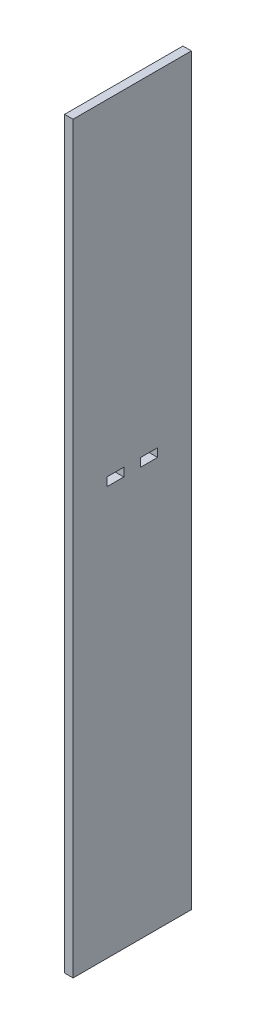
ISO-10303-21;
HEADER;
FILE_DESCRIPTION(('STEP AP214'),'2;1');
FILE_NAME('part.step','',(''),(''),'','','');
FILE_SCHEMA(('AUTOMOTIVE_DESIGN { 1 0 10303 214 1 1 1 1 }'));
ENDSEC;
DATA;
#1=APPLICATION_CONTEXT('core data for automotive mechanical design processes');
#2=APPLICATION_PROTOCOL_DEFINITION('international standard','automotive_design',2000,#1);
#3=PRODUCT_CONTEXT('',#1,'mechanical');
#4=PRODUCT('Part','Part','',(#3));
#5=PRODUCT_RELATED_PRODUCT_CATEGORY('part','',(#4));
#6=PRODUCT_DEFINITION_FORMATION('','',#4);
#7=PRODUCT_DEFINITION_CONTEXT('part definition',#1,'design');
#8=PRODUCT_DEFINITION('design','',#6,#7);
#9=PRODUCT_DEFINITION_SHAPE('','',#8);
#10=(LENGTH_UNIT() NAMED_UNIT(*) SI_UNIT(.MILLI.,.METRE.));
#11=(NAMED_UNIT(*) PLANE_ANGLE_UNIT() SI_UNIT($,.RADIAN.));
#12=(NAMED_UNIT(*) SI_UNIT($,.STERADIAN.) SOLID_ANGLE_UNIT());
#13=UNCERTAINTY_MEASURE_WITH_UNIT(LENGTH_MEASURE(1.E-05),#10,'distance_accuracy_value','');
#14=(GEOMETRIC_REPRESENTATION_CONTEXT(3) GLOBAL_UNCERTAINTY_ASSIGNED_CONTEXT((#13)) GLOBAL_UNIT_ASSIGNED_CONTEXT((#10,
#11,#12)) REPRESENTATION_CONTEXT('',''));
#15=CARTESIAN_POINT('',(0.,0.,0.));
#16=DIRECTION('',(0.,0.,1.));
#17=DIRECTION('',(1.,0.,0.));
#18=AXIS2_PLACEMENT_3D('',#15,#16,#17);
#19=CARTESIAN_POINT('',(-38.1,558.8,44.45));
#20=DIRECTION('',(-1.,0.,0.));
#21=DIRECTION('',(0.,0.,1.));
#22=AXIS2_PLACEMENT_3D('',#19,#20,#21);
#23=PLANE('',#22);
#24=DIRECTION('',(0.,0.,-1.));
#25=VECTOR('',#24,1.);
#26=CARTESIAN_POINT('',(-38.1,313.305,6.34999999999996));
#27=LINE('',#26,#25);
#28=CARTESIAN_POINT('',(-38.1,313.305,19.05));
#29=VERTEX_POINT('',#28);
#30=CARTESIAN_POINT('',(-38.1,313.305,6.34999999999996));
#31=VERTEX_POINT('',#30);
#32=EDGE_CURVE('E128',#29,#31,#27,.T.);
#33=ORIENTED_EDGE('',*,*,#32,.T.);
#34=DIRECTION('',(0.,-1.,0.));
#35=VECTOR('',#34,1.);
#36=CARTESIAN_POINT('',(-38.1,313.305,6.34999999999996));
#37=LINE('',#36,#35);
#38=CARTESIAN_POINT('',(-38.1,306.955,6.34999999999996));
#39=VERTEX_POINT('',#38);
#40=EDGE_CURVE('E122',#31,#39,#37,.T.);
#41=ORIENTED_EDGE('',*,*,#40,.T.);
#42=DIRECTION('',(0.,0.,1.));
#43=VECTOR('',#42,1.);
#44=CARTESIAN_POINT('',(-38.1,306.955,6.34999999999996));
#45=LINE('',#44,#43);
#46=CARTESIAN_POINT('',(-38.1,306.955,19.05));
#47=VERTEX_POINT('',#46);
#48=EDGE_CURVE('E131',#39,#47,#45,.T.);
#49=ORIENTED_EDGE('',*,*,#48,.T.);
#50=DIRECTION('',(0.,1.,0.));
#51=VECTOR('',#50,1.);
#52=CARTESIAN_POINT('',(-38.1,313.305,19.05));
#53=LINE('',#52,#51);
#54=EDGE_CURVE('E46',#47,#29,#53,.T.);
#55=ORIENTED_EDGE('',*,*,#54,.T.);
#56=EDGE_LOOP('',(#33,#41,#49,#55));
#57=FACE_BOUND('',#56,.T.);
#58=DIRECTION('',(0.,0.,-1.));
#59=VECTOR('',#58,1.);
#60=CARTESIAN_POINT('',(-38.1,313.305,-19.05));
#61=LINE('',#60,#59);
#62=CARTESIAN_POINT('',(-38.1,313.305,-6.35000000000004));
#63=VERTEX_POINT('',#62);
#64=CARTESIAN_POINT('',(-38.1,313.305,-19.05));
#65=VERTEX_POINT('',#64);
#66=EDGE_CURVE('E166',#63,#65,#61,.T.);
#67=ORIENTED_EDGE('',*,*,#66,.T.);
#68=DIRECTION('',(0.,-1.,0.));
#69=VECTOR('',#68,1.);
#70=CARTESIAN_POINT('',(-38.1,313.305,-19.05));
#71=LINE('',#70,#69);
#72=CARTESIAN_POINT('',(-38.1,306.955,-19.05));
#73=VERTEX_POINT('',#72);
#74=EDGE_CURVE('E156',#65,#73,#71,.T.);
#75=ORIENTED_EDGE('',*,*,#74,.T.);
#76=DIRECTION('',(0.,0.,1.));
#77=VECTOR('',#76,1.);
#78=CARTESIAN_POINT('',(-38.1,306.955,-19.05));
#79=LINE('',#78,#77);
#80=CARTESIAN_POINT('',(-38.1,306.955,-6.35000000000004));
#81=VERTEX_POINT('',#80);
#82=EDGE_CURVE('E159',#73,#81,#79,.T.);
#83=ORIENTED_EDGE('',*,*,#82,.T.);
#84=DIRECTION('',(0.,1.,0.));
#85=VECTOR('',#84,1.);
#86=CARTESIAN_POINT('',(-38.1,313.305,-6.35000000000004));
#87=LINE('',#86,#85);
#88=EDGE_CURVE('E163',#81,#63,#87,.T.);
#89=ORIENTED_EDGE('',*,*,#88,.T.);
#90=EDGE_LOOP('',(#67,#75,#83,#89));
#91=FACE_BOUND('',#90,.T.);
#92=DIRECTION('',(0.,0.,-1.));
#93=VECTOR('',#92,1.);
#94=CARTESIAN_POINT('',(-38.1,0.,44.45));
#95=LINE('',#94,#93);
#96=CARTESIAN_POINT('',(-38.1,0.,44.45));
#97=VERTEX_POINT('',#96);
#98=CARTESIAN_POINT('',(-38.1,0.,-44.45));
#99=VERTEX_POINT('',#98);
#100=EDGE_CURVE('E181',#97,#99,#95,.T.);
#101=ORIENTED_EDGE('',*,*,#100,.T.);
#102=DIRECTION('',(0.,-1.,0.));
#103=VECTOR('',#102,1.);
#104=CARTESIAN_POINT('',(-38.1,558.8,-44.45));
#105=LINE('',#104,#103);
#106=CARTESIAN_POINT('',(-38.1,558.8,-44.45));
#107=VERTEX_POINT('',#106);
#108=EDGE_CURVE('E11',#107,#99,#105,.T.);
#109=ORIENTED_EDGE('',*,*,#108,.F.);
#110=DIRECTION('',(0.,0.,-1.));
#111=VECTOR('',#110,1.);
#112=CARTESIAN_POINT('',(-38.1,558.8,44.45));
#113=LINE('',#112,#111);
#114=CARTESIAN_POINT('',(-38.1,558.8,44.45));
#115=VERTEX_POINT('',#114);
#116=EDGE_CURVE('E188',#115,#107,#113,.T.);
#117=ORIENTED_EDGE('',*,*,#116,.F.);
#118=DIRECTION('',(0.,-1.,0.));
#119=VECTOR('',#118,1.);
#120=CARTESIAN_POINT('',(-38.1,558.8,44.45));
#121=LINE('',#120,#119);
#122=EDGE_CURVE('E198',#115,#97,#121,.T.);
#123=ORIENTED_EDGE('',*,*,#122,.T.);
#124=EDGE_LOOP('',(#101,#109,#117,#123));
#125=FACE_BOUND('',#124,.T.);
#126=ADVANCED_FACE('F32',(#57,#91,#125),#23,.F.);
#127=CARTESIAN_POINT('',(-38.1,558.8,-44.45));
#128=DIRECTION('',(0.,0.,1.));
#129=DIRECTION('',(1.,0.,0.));
#130=AXIS2_PLACEMENT_3D('',#127,#128,#129);
#131=PLANE('',#130);
#132=DIRECTION('',(-1.,0.,0.));
#133=VECTOR('',#132,1.);
#134=CARTESIAN_POINT('',(-38.1,0.,-44.45));
#135=LINE('',#134,#133);
#136=CARTESIAN_POINT('',(-44.45,0.,-44.45));
#137=VERTEX_POINT('',#136);
#138=EDGE_CURVE('E201',#99,#137,#135,.T.);
#139=ORIENTED_EDGE('',*,*,#138,.T.);
#140=DIRECTION('',(0.,-1.,0.));
#141=VECTOR('',#140,1.);
#142=CARTESIAN_POINT('',(-44.45,558.8,-44.45));
#143=LINE('',#142,#141);
#144=CARTESIAN_POINT('',(-44.45,558.8,-44.45));
#145=VERTEX_POINT('',#144);
#146=EDGE_CURVE('E39',#145,#137,#143,.T.);
#147=ORIENTED_EDGE('',*,*,#146,.F.);
#148=DIRECTION('',(-1.,0.,0.));
#149=VECTOR('',#148,1.);
#150=CARTESIAN_POINT('',(-38.1,558.8,-44.45));
#151=LINE('',#150,#149);
#152=EDGE_CURVE('E191',#107,#145,#151,.T.);
#153=ORIENTED_EDGE('',*,*,#152,.F.);
#154=ORIENTED_EDGE('',*,*,#108,.T.);
#155=EDGE_LOOP('',(#139,#147,#153,#154));
#156=FACE_BOUND('',#155,.T.);
#157=ADVANCED_FACE('F231',(#156),#131,.F.);
#158=CARTESIAN_POINT('',(-44.45,558.8,44.45));
#159=DIRECTION('',(1.,0.,0.));
#160=DIRECTION('',(0.,0.,-1.));
#161=AXIS2_PLACEMENT_3D('',#158,#159,#160);
#162=PLANE('',#161);
#163=DIRECTION('',(0.,0.,1.));
#164=VECTOR('',#163,1.);
#165=CARTESIAN_POINT('',(-44.45,306.955,6.34999999999996));
#166=LINE('',#165,#164);
#167=CARTESIAN_POINT('',(-44.45,306.955,6.34999999999997));
#168=VERTEX_POINT('',#167);
#169=CARTESIAN_POINT('',(-44.45,306.955,19.05));
#170=VERTEX_POINT('',#169);
#171=EDGE_CURVE('E146',#168,#170,#166,.T.);
#172=ORIENTED_EDGE('',*,*,#171,.F.);
#173=DIRECTION('',(0.,-1.,0.));
#174=VECTOR('',#173,1.);
#175=CARTESIAN_POINT('',(-44.45,313.305,6.34999999999996));
#176=LINE('',#175,#174);
#177=CARTESIAN_POINT('',(-44.45,313.305,6.34999999999996));
#178=VERTEX_POINT('',#177);
#179=EDGE_CURVE('E54',#178,#168,#176,.T.);
#180=ORIENTED_EDGE('',*,*,#179,.F.);
#181=DIRECTION('',(0.,0.,-1.));
#182=VECTOR('',#181,1.);
#183=CARTESIAN_POINT('',(-44.45,313.305,6.34999999999996));
#184=LINE('',#183,#182);
#185=CARTESIAN_POINT('',(-44.45,313.305,19.05));
#186=VERTEX_POINT('',#185);
#187=EDGE_CURVE('E137',#186,#178,#184,.T.);
#188=ORIENTED_EDGE('',*,*,#187,.F.);
#189=DIRECTION('',(0.,1.,0.));
#190=VECTOR('',#189,1.);
#191=CARTESIAN_POINT('',(-44.45,313.305,19.05));
#192=LINE('',#191,#190);
#193=EDGE_CURVE('E140',#170,#186,#192,.T.);
#194=ORIENTED_EDGE('',*,*,#193,.F.);
#195=EDGE_LOOP('',(#172,#180,#188,#194));
#196=FACE_BOUND('',#195,.T.);
#197=DIRECTION('',(0.,0.,1.));
#198=VECTOR('',#197,1.);
#199=CARTESIAN_POINT('',(-44.45,306.955,-19.05));
#200=LINE('',#199,#198);
#201=CARTESIAN_POINT('',(-44.45,306.955,-19.05));
#202=VERTEX_POINT('',#201);
#203=CARTESIAN_POINT('',(-44.45,306.955,-6.35000000000004));
#204=VERTEX_POINT('',#203);
#205=EDGE_CURVE('E171',#202,#204,#200,.T.);
#206=ORIENTED_EDGE('',*,*,#205,.F.);
#207=DIRECTION('',(0.,-1.,0.));
#208=VECTOR('',#207,1.);
#209=CARTESIAN_POINT('',(-44.45,313.305,-19.05));
#210=LINE('',#209,#208);
#211=CARTESIAN_POINT('',(-44.45,313.305,-19.05));
#212=VERTEX_POINT('',#211);
#213=EDGE_CURVE('E152',#212,#202,#210,.T.);
#214=ORIENTED_EDGE('',*,*,#213,.F.);
#215=DIRECTION('',(0.,0.,-1.));
#216=VECTOR('',#215,1.);
#217=CARTESIAN_POINT('',(-44.45,313.305,-19.05));
#218=LINE('',#217,#216);
#219=CARTESIAN_POINT('',(-44.45,313.305,-6.35000000000004));
#220=VERTEX_POINT('',#219);
#221=EDGE_CURVE('E160',#220,#212,#218,.T.);
#222=ORIENTED_EDGE('',*,*,#221,.F.);
#223=DIRECTION('',(0.,1.,0.));
#224=VECTOR('',#223,1.);
#225=CARTESIAN_POINT('',(-44.45,313.305,-6.35000000000004));
#226=LINE('',#225,#224);
#227=EDGE_CURVE('E174',#204,#220,#226,.T.);
#228=ORIENTED_EDGE('',*,*,#227,.F.);
#229=EDGE_LOOP('',(#206,#214,#222,#228));
#230=FACE_BOUND('',#229,.T.);
#231=DIRECTION('',(0.,0.,1.));
#232=VECTOR('',#231,1.);
#233=CARTESIAN_POINT('',(-44.45,0.,44.45));
#234=LINE('',#233,#232);
#235=CARTESIAN_POINT('',(-44.45,0.,44.45));
#236=VERTEX_POINT('',#235);
#237=EDGE_CURVE('E203',#137,#236,#234,.T.);
#238=ORIENTED_EDGE('',*,*,#237,.T.);
#239=DIRECTION('',(0.,-1.,0.));
#240=VECTOR('',#239,1.);
#241=CARTESIAN_POINT('',(-44.45,558.8,44.45));
#242=LINE('',#241,#240);
#243=CARTESIAN_POINT('',(-44.45,558.8,44.45));
#244=VERTEX_POINT('',#243);
#245=EDGE_CURVE('E208',#244,#236,#242,.T.);
#246=ORIENTED_EDGE('',*,*,#245,.F.);
#247=DIRECTION('',(0.,0.,1.));
#248=VECTOR('',#247,1.);
#249=CARTESIAN_POINT('',(-44.45,558.8,44.45));
#250=LINE('',#249,#248);
#251=EDGE_CURVE('E194',#145,#244,#250,.T.);
#252=ORIENTED_EDGE('',*,*,#251,.F.);
#253=ORIENTED_EDGE('',*,*,#146,.T.);
#254=EDGE_LOOP('',(#238,#246,#252,#253));
#255=FACE_BOUND('',#254,.T.);
#256=ADVANCED_FACE('F215',(#196,#230,#255),#162,.F.);
#257=CARTESIAN_POINT('',(-38.1,558.8,44.45));
#258=DIRECTION('',(0.,0.,-1.));
#259=DIRECTION('',(-1.,0.,0.));
#260=AXIS2_PLACEMENT_3D('',#257,#258,#259);
#261=PLANE('',#260);
#262=DIRECTION('',(1.,0.,0.));
#263=VECTOR('',#262,1.);
#264=CARTESIAN_POINT('',(-38.1,0.,44.45));
#265=LINE('',#264,#263);
#266=EDGE_CURVE('E192',#236,#97,#265,.T.);
#267=ORIENTED_EDGE('',*,*,#266,.T.);
#268=ORIENTED_EDGE('',*,*,#122,.F.);
#269=DIRECTION('',(1.,0.,0.));
#270=VECTOR('',#269,1.);
#271=CARTESIAN_POINT('',(-38.1,558.8,44.45));
#272=LINE('',#271,#270);
#273=EDGE_CURVE('E196',#244,#115,#272,.T.);
#274=ORIENTED_EDGE('',*,*,#273,.F.);
#275=ORIENTED_EDGE('',*,*,#245,.T.);
#276=EDGE_LOOP('',(#267,#268,#274,#275));
#277=FACE_BOUND('',#276,.T.);
#278=ADVANCED_FACE('F224',(#277),#261,.F.);
#279=CARTESIAN_POINT('',(0.,558.8,0.));
#280=DIRECTION('',(0.,1.,0.));
#281=DIRECTION('',(0.,0.,1.));
#282=AXIS2_PLACEMENT_3D('',#279,#280,#281);
#283=PLANE('',#282);
#284=ORIENTED_EDGE('',*,*,#116,.T.);
#285=ORIENTED_EDGE('',*,*,#152,.T.);
#286=ORIENTED_EDGE('',*,*,#251,.T.);
#287=ORIENTED_EDGE('',*,*,#273,.T.);
#288=EDGE_LOOP('',(#284,#285,#286,#287));
#289=FACE_BOUND('',#288,.T.);
#290=ADVANCED_FACE('F230',(#289),#283,.T.);
#291=CARTESIAN_POINT('',(0.,0.,0.));
#292=DIRECTION('',(0.,1.,0.));
#293=DIRECTION('',(0.,0.,1.));
#294=AXIS2_PLACEMENT_3D('',#291,#292,#293);
#295=PLANE('',#294);
#296=ORIENTED_EDGE('',*,*,#100,.F.);
#297=ORIENTED_EDGE('',*,*,#266,.F.);
#298=ORIENTED_EDGE('',*,*,#237,.F.);
#299=ORIENTED_EDGE('',*,*,#138,.F.);
#300=EDGE_LOOP('',(#296,#297,#298,#299));
#301=FACE_BOUND('',#300,.T.);
#302=ADVANCED_FACE('F221',(#301),#295,.F.);
#303=CARTESIAN_POINT('',(-38.1,313.305,-19.05));
#304=DIRECTION('',(0.,0.,-1.));
#305=DIRECTION('',(-1.,0.,0.));
#306=AXIS2_PLACEMENT_3D('',#303,#304,#305);
#307=PLANE('',#306);
#308=ORIENTED_EDGE('',*,*,#213,.T.);
#309=DIRECTION('',(-1.,0.,0.));
#310=VECTOR('',#309,1.);
#311=CARTESIAN_POINT('',(-38.1,306.955,-19.05));
#312=LINE('',#311,#310);
#313=EDGE_CURVE('E169',#73,#202,#312,.T.);
#314=ORIENTED_EDGE('',*,*,#313,.F.);
#315=ORIENTED_EDGE('',*,*,#74,.F.);
#316=DIRECTION('',(-1.,0.,0.));
#317=VECTOR('',#316,1.);
#318=CARTESIAN_POINT('',(-38.1,313.305,-19.05));
#319=LINE('',#318,#317);
#320=EDGE_CURVE('E179',#65,#212,#319,.T.);
#321=ORIENTED_EDGE('',*,*,#320,.T.);
#322=EDGE_LOOP('',(#308,#314,#315,#321));
#323=FACE_BOUND('',#322,.T.);
#324=ADVANCED_FACE('F244',(#323),#307,.F.);
#325=CARTESIAN_POINT('',(-38.1,313.305,-19.05));
#326=DIRECTION('',(0.,1.,0.));
#327=DIRECTION('',(0.,0.,1.));
#328=AXIS2_PLACEMENT_3D('',#325,#326,#327);
#329=PLANE('',#328);
#330=ORIENTED_EDGE('',*,*,#221,.T.);
#331=ORIENTED_EDGE('',*,*,#320,.F.);
#332=ORIENTED_EDGE('',*,*,#66,.F.);
#333=DIRECTION('',(-1.,0.,0.));
#334=VECTOR('',#333,1.);
#335=CARTESIAN_POINT('',(-38.1,313.305,-6.35000000000004));
#336=LINE('',#335,#334);
#337=EDGE_CURVE('E182',#63,#220,#336,.T.);
#338=ORIENTED_EDGE('',*,*,#337,.T.);
#339=EDGE_LOOP('',(#330,#331,#332,#338));
#340=FACE_BOUND('',#339,.T.);
#341=ADVANCED_FACE('F249',(#340),#329,.F.);
#342=CARTESIAN_POINT('',(-38.1,313.305,-6.35000000000004));
#343=DIRECTION('',(0.,0.,1.));
#344=DIRECTION('',(0.,-1.,0.));
#345=AXIS2_PLACEMENT_3D('',#342,#343,#344);
#346=PLANE('',#345);
#347=ORIENTED_EDGE('',*,*,#227,.T.);
#348=ORIENTED_EDGE('',*,*,#337,.F.);
#349=ORIENTED_EDGE('',*,*,#88,.F.);
#350=DIRECTION('',(-1.,0.,0.));
#351=VECTOR('',#350,1.);
#352=CARTESIAN_POINT('',(-38.1,306.955,-6.35000000000004));
#353=LINE('',#352,#351);
#354=EDGE_CURVE('E184',#81,#204,#353,.T.);
#355=ORIENTED_EDGE('',*,*,#354,.T.);
#356=EDGE_LOOP('',(#347,#348,#349,#355));
#357=FACE_BOUND('',#356,.T.);
#358=ADVANCED_FACE('F254',(#357),#346,.F.);
#359=CARTESIAN_POINT('',(-38.1,306.955,-19.05));
#360=DIRECTION('',(0.,-1.,0.));
#361=DIRECTION('',(0.,0.,-1.));
#362=AXIS2_PLACEMENT_3D('',#359,#360,#361);
#363=PLANE('',#362);
#364=ORIENTED_EDGE('',*,*,#205,.T.);
#365=ORIENTED_EDGE('',*,*,#354,.F.);
#366=ORIENTED_EDGE('',*,*,#82,.F.);
#367=ORIENTED_EDGE('',*,*,#313,.T.);
#368=EDGE_LOOP('',(#364,#365,#366,#367));
#369=FACE_BOUND('',#368,.T.);
#370=ADVANCED_FACE('F251',(#369),#363,.F.);
#371=CARTESIAN_POINT('',(-38.1,313.305,6.34999999999996));
#372=DIRECTION('',(0.,0.,-1.));
#373=DIRECTION('',(0.,1.,0.));
#374=AXIS2_PLACEMENT_3D('',#371,#372,#373);
#375=PLANE('',#374);
#376=ORIENTED_EDGE('',*,*,#179,.T.);
#377=DIRECTION('',(-1.,0.,0.));
#378=VECTOR('',#377,1.);
#379=CARTESIAN_POINT('',(-38.1,306.955,6.34999999999996));
#380=LINE('',#379,#378);
#381=EDGE_CURVE('E118',#39,#168,#380,.T.);
#382=ORIENTED_EDGE('',*,*,#381,.F.);
#383=ORIENTED_EDGE('',*,*,#40,.F.);
#384=DIRECTION('',(-1.,0.,0.));
#385=VECTOR('',#384,1.);
#386=CARTESIAN_POINT('',(-38.1,313.305,6.34999999999996));
#387=LINE('',#386,#385);
#388=EDGE_CURVE('E150',#31,#178,#387,.T.);
#389=ORIENTED_EDGE('',*,*,#388,.T.);
#390=EDGE_LOOP('',(#376,#382,#383,#389));
#391=FACE_BOUND('',#390,.T.);
#392=ADVANCED_FACE('F120',(#391),#375,.F.);
#393=CARTESIAN_POINT('',(-38.1,313.305,6.34999999999996));
#394=DIRECTION('',(0.,1.,0.));
#395=DIRECTION('',(0.,0.,1.));
#396=AXIS2_PLACEMENT_3D('',#393,#394,#395);
#397=PLANE('',#396);
#398=ORIENTED_EDGE('',*,*,#187,.T.);
#399=ORIENTED_EDGE('',*,*,#388,.F.);
#400=ORIENTED_EDGE('',*,*,#32,.F.);
#401=DIRECTION('',(-1.,0.,0.));
#402=VECTOR('',#401,1.);
#403=CARTESIAN_POINT('',(-38.1,313.305,19.05));
#404=LINE('',#403,#402);
#405=EDGE_CURVE('E153',#29,#186,#404,.T.);
#406=ORIENTED_EDGE('',*,*,#405,.T.);
#407=EDGE_LOOP('',(#398,#399,#400,#406));
#408=FACE_BOUND('',#407,.T.);
#409=ADVANCED_FACE('F264',(#408),#397,.F.);
#410=CARTESIAN_POINT('',(-38.1,313.305,19.05));
#411=DIRECTION('',(0.,0.,1.));
#412=DIRECTION('',(0.,-1.,0.));
#413=AXIS2_PLACEMENT_3D('',#410,#411,#412);
#414=PLANE('',#413);
#415=ORIENTED_EDGE('',*,*,#193,.T.);
#416=ORIENTED_EDGE('',*,*,#405,.F.);
#417=ORIENTED_EDGE('',*,*,#54,.F.);
#418=DIRECTION('',(-1.,0.,0.));
#419=VECTOR('',#418,1.);
#420=CARTESIAN_POINT('',(-38.1,306.955,19.05));
#421=LINE('',#420,#419);
#422=EDGE_CURVE('E127',#47,#170,#421,.T.);
#423=ORIENTED_EDGE('',*,*,#422,.T.);
#424=EDGE_LOOP('',(#415,#416,#417,#423));
#425=FACE_BOUND('',#424,.T.);
#426=ADVANCED_FACE('F267',(#425),#414,.F.);
#427=CARTESIAN_POINT('',(-38.1,306.955,6.34999999999996));
#428=DIRECTION('',(0.,-1.,0.));
#429=DIRECTION('',(0.,0.,-1.));
#430=AXIS2_PLACEMENT_3D('',#427,#428,#429);
#431=PLANE('',#430);
#432=ORIENTED_EDGE('',*,*,#171,.T.);
#433=ORIENTED_EDGE('',*,*,#422,.F.);
#434=ORIENTED_EDGE('',*,*,#48,.F.);
#435=ORIENTED_EDGE('',*,*,#381,.T.);
#436=EDGE_LOOP('',(#432,#433,#434,#435));
#437=FACE_BOUND('',#436,.T.);
#438=ADVANCED_FACE('F132',(#437),#431,.F.);
#439=CLOSED_SHELL('',(#126,#157,#256,#278,#290,#302,#324,#341,#358,#370,#392,#409,#426,#438));
#440=MANIFOLD_SOLID_BREP('B2',#439);
#441=ADVANCED_BREP_SHAPE_REPRESENTATION('',(#18,#440),#14);
#442=SHAPE_DEFINITION_REPRESENTATION(#9,#441);
ENDSEC;
END-ISO-10303-21;
